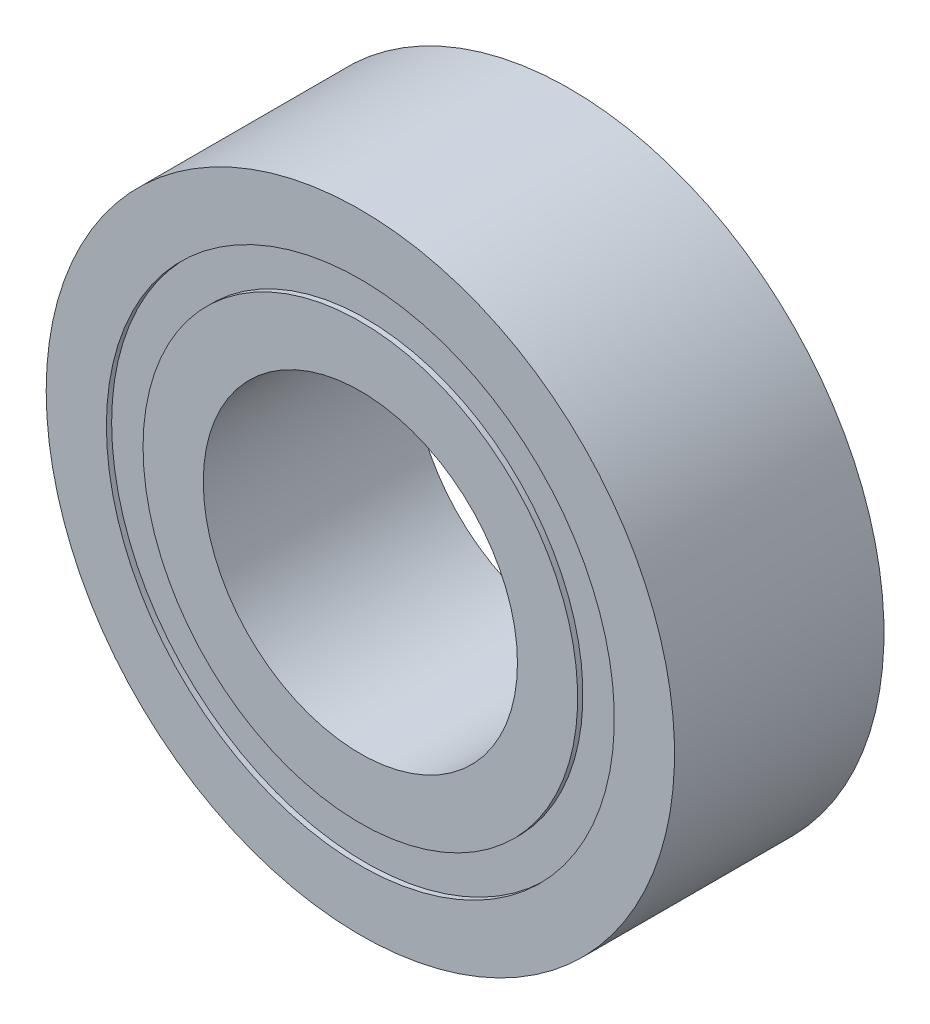
ISO-10303-21;
HEADER;
FILE_DESCRIPTION(('STEP AP214'),'2;1');
FILE_NAME('part.step','',(''),(''),'','','');
FILE_SCHEMA(('AUTOMOTIVE_DESIGN { 1 0 10303 214 1 1 1 1 }'));
ENDSEC;
DATA;
#1=APPLICATION_CONTEXT('core data for automotive mechanical design processes');
#2=APPLICATION_PROTOCOL_DEFINITION('international standard','automotive_design',2000,#1);
#3=PRODUCT_CONTEXT('',#1,'mechanical');
#4=PRODUCT('Part','Part','',(#3));
#5=PRODUCT_RELATED_PRODUCT_CATEGORY('part','',(#4));
#6=PRODUCT_DEFINITION_FORMATION('','',#4);
#7=PRODUCT_DEFINITION_CONTEXT('part definition',#1,'design');
#8=PRODUCT_DEFINITION('design','',#6,#7);
#9=PRODUCT_DEFINITION_SHAPE('','',#8);
#10=(LENGTH_UNIT() NAMED_UNIT(*) SI_UNIT(.MILLI.,.METRE.));
#11=(NAMED_UNIT(*) PLANE_ANGLE_UNIT() SI_UNIT($,.RADIAN.));
#12=(NAMED_UNIT(*) SI_UNIT($,.STERADIAN.) SOLID_ANGLE_UNIT());
#13=UNCERTAINTY_MEASURE_WITH_UNIT(LENGTH_MEASURE(1.E-05),#10,'distance_accuracy_value','');
#14=(GEOMETRIC_REPRESENTATION_CONTEXT(3) GLOBAL_UNCERTAINTY_ASSIGNED_CONTEXT((#13)) GLOBAL_UNIT_ASSIGNED_CONTEXT((#10,
#11,#12)) REPRESENTATION_CONTEXT('',''));
#15=CARTESIAN_POINT('',(0.,0.,0.));
#16=DIRECTION('',(0.,0.,1.));
#17=DIRECTION('',(1.,0.,0.));
#18=AXIS2_PLACEMENT_3D('',#15,#16,#17);
#19=CARTESIAN_POINT('',(0.,0.,0.));
#20=DIRECTION('',(0.,0.,-1.));
#21=DIRECTION('',(-1.,0.,0.));
#22=AXIS2_PLACEMENT_3D('',#19,#20,#21);
#23=CYLINDRICAL_SURFACE('',#22,3.);
#24=CARTESIAN_POINT('',(0.,0.,4.));
#25=DIRECTION('',(0.,0.,-1.));
#26=DIRECTION('',(-1.,0.,0.));
#27=AXIS2_PLACEMENT_3D('',#24,#25,#26);
#28=CIRCLE('',#27,3.);
#29=CARTESIAN_POINT('',(-3.,0.,4.));
#30=VERTEX_POINT('',#29);
#31=EDGE_CURVE('E67',#30,#30,#28,.T.);
#32=ORIENTED_EDGE('',*,*,#31,.F.);
#33=EDGE_LOOP('',(#32));
#34=FACE_BOUND('',#33,.T.);
#35=CARTESIAN_POINT('',(0.,0.,0.));
#36=DIRECTION('',(0.,0.,-1.));
#37=DIRECTION('',(-1.,0.,0.));
#38=AXIS2_PLACEMENT_3D('',#35,#36,#37);
#39=CIRCLE('',#38,3.);
#40=CARTESIAN_POINT('',(-3.,0.,0.));
#41=VERTEX_POINT('',#40);
#42=EDGE_CURVE('E10',#41,#41,#39,.T.);
#43=ORIENTED_EDGE('',*,*,#42,.T.);
#44=EDGE_LOOP('',(#43));
#45=FACE_BOUND('',#44,.T.);
#46=ADVANCED_FACE('F15',(#34,#45),#23,.F.);
#47=CARTESIAN_POINT('',(3.575,0.,0.));
#48=DIRECTION('',(0.,0.,1.));
#49=DIRECTION('',(1.,0.,0.));
#50=AXIS2_PLACEMENT_3D('',#47,#48,#49);
#51=PLANE('',#50);
#52=ORIENTED_EDGE('',*,*,#42,.F.);
#53=EDGE_LOOP('',(#52));
#54=FACE_BOUND('',#53,.T.);
#55=CARTESIAN_POINT('',(0.,0.,0.));
#56=DIRECTION('',(0.,0.,-1.));
#57=DIRECTION('',(-1.,0.,0.));
#58=AXIS2_PLACEMENT_3D('',#55,#56,#57);
#59=CIRCLE('',#58,4.15);
#60=CARTESIAN_POINT('',(-4.15,0.,0.));
#61=VERTEX_POINT('',#60);
#62=EDGE_CURVE('E22',#61,#61,#59,.T.);
#63=ORIENTED_EDGE('',*,*,#62,.T.);
#64=EDGE_LOOP('',(#63));
#65=FACE_BOUND('',#64,.T.);
#66=ADVANCED_FACE('F75',(#54,#65),#51,.F.);
#67=CARTESIAN_POINT('',(0.,0.,0.));
#68=DIRECTION('',(0.,0.,-1.));
#69=DIRECTION('',(-1.,0.,0.));
#70=AXIS2_PLACEMENT_3D('',#67,#68,#69);
#71=CYLINDRICAL_SURFACE('',#70,4.15);
#72=ORIENTED_EDGE('',*,*,#62,.F.);
#73=EDGE_LOOP('',(#72));
#74=FACE_BOUND('',#73,.T.);
#75=CARTESIAN_POINT('',(0.,0.,0.1));
#76=DIRECTION('',(0.,0.,-1.));
#77=DIRECTION('',(-1.,0.,0.));
#78=AXIS2_PLACEMENT_3D('',#75,#76,#77);
#79=CIRCLE('',#78,4.15);
#80=CARTESIAN_POINT('',(-4.15,0.,0.1));
#81=VERTEX_POINT('',#80);
#82=EDGE_CURVE('E30',#81,#81,#79,.T.);
#83=ORIENTED_EDGE('',*,*,#82,.T.);
#84=EDGE_LOOP('',(#83));
#85=FACE_BOUND('',#84,.T.);
#86=ADVANCED_FACE('F79',(#74,#85),#71,.T.);
#87=CARTESIAN_POINT('',(4.5,0.,0.1));
#88=DIRECTION('',(0.,0.,1.));
#89=DIRECTION('',(1.,0.,0.));
#90=AXIS2_PLACEMENT_3D('',#87,#88,#89);
#91=PLANE('',#90);
#92=ORIENTED_EDGE('',*,*,#82,.F.);
#93=EDGE_LOOP('',(#92));
#94=FACE_BOUND('',#93,.T.);
#95=CARTESIAN_POINT('',(0.,0.,0.1));
#96=DIRECTION('',(0.,0.,-1.));
#97=DIRECTION('',(-1.,0.,0.));
#98=AXIS2_PLACEMENT_3D('',#95,#96,#97);
#99=CIRCLE('',#98,4.85);
#100=CARTESIAN_POINT('',(-4.85,0.,0.1));
#101=VERTEX_POINT('',#100);
#102=EDGE_CURVE('E37',#101,#101,#99,.T.);
#103=ORIENTED_EDGE('',*,*,#102,.T.);
#104=EDGE_LOOP('',(#103));
#105=FACE_BOUND('',#104,.T.);
#106=ADVANCED_FACE('F83',(#94,#105),#91,.F.);
#107=CARTESIAN_POINT('',(0.,0.,0.));
#108=DIRECTION('',(0.,0.,-1.));
#109=DIRECTION('',(-1.,0.,0.));
#110=AXIS2_PLACEMENT_3D('',#107,#108,#109);
#111=CYLINDRICAL_SURFACE('',#110,4.85);
#112=ORIENTED_EDGE('',*,*,#102,.F.);
#113=EDGE_LOOP('',(#112));
#114=FACE_BOUND('',#113,.T.);
#115=CARTESIAN_POINT('',(0.,0.,0.));
#116=DIRECTION('',(0.,0.,-1.));
#117=DIRECTION('',(-1.,0.,0.));
#118=AXIS2_PLACEMENT_3D('',#115,#116,#117);
#119=CIRCLE('',#118,4.85);
#120=CARTESIAN_POINT('',(-4.85,0.,0.));
#121=VERTEX_POINT('',#120);
#122=EDGE_CURVE('E43',#121,#121,#119,.T.);
#123=ORIENTED_EDGE('',*,*,#122,.T.);
#124=EDGE_LOOP('',(#123));
#125=FACE_BOUND('',#124,.T.);
#126=ADVANCED_FACE('F89',(#114,#125),#111,.F.);
#127=CARTESIAN_POINT('',(5.425,0.,0.));
#128=DIRECTION('',(0.,0.,1.));
#129=DIRECTION('',(1.,0.,0.));
#130=AXIS2_PLACEMENT_3D('',#127,#128,#129);
#131=PLANE('',#130);
#132=ORIENTED_EDGE('',*,*,#122,.F.);
#133=EDGE_LOOP('',(#132));
#134=FACE_BOUND('',#133,.T.);
#135=CARTESIAN_POINT('',(0.,0.,0.));
#136=DIRECTION('',(0.,0.,-1.));
#137=DIRECTION('',(-1.,0.,0.));
#138=AXIS2_PLACEMENT_3D('',#135,#136,#137);
#139=CIRCLE('',#138,6.);
#140=CARTESIAN_POINT('',(-6.,0.,0.));
#141=VERTEX_POINT('',#140);
#142=EDGE_CURVE('E47',#141,#141,#139,.T.);
#143=ORIENTED_EDGE('',*,*,#142,.T.);
#144=EDGE_LOOP('',(#143));
#145=FACE_BOUND('',#144,.T.);
#146=ADVANCED_FACE('F93',(#134,#145),#131,.F.);
#147=CARTESIAN_POINT('',(0.,0.,0.));
#148=DIRECTION('',(0.,0.,-1.));
#149=DIRECTION('',(-1.,0.,0.));
#150=AXIS2_PLACEMENT_3D('',#147,#148,#149);
#151=CYLINDRICAL_SURFACE('',#150,6.);
#152=ORIENTED_EDGE('',*,*,#142,.F.);
#153=EDGE_LOOP('',(#152));
#154=FACE_BOUND('',#153,.T.);
#155=CARTESIAN_POINT('',(0.,0.,4.));
#156=DIRECTION('',(0.,0.,-1.));
#157=DIRECTION('',(-1.,0.,0.));
#158=AXIS2_PLACEMENT_3D('',#155,#156,#157);
#159=CIRCLE('',#158,6.);
#160=CARTESIAN_POINT('',(-6.,0.,4.));
#161=VERTEX_POINT('',#160);
#162=EDGE_CURVE('E51',#161,#161,#159,.T.);
#163=ORIENTED_EDGE('',*,*,#162,.T.);
#164=EDGE_LOOP('',(#163));
#165=FACE_BOUND('',#164,.T.);
#166=ADVANCED_FACE('F97',(#154,#165),#151,.T.);
#167=CARTESIAN_POINT('',(5.425,0.,4.));
#168=DIRECTION('',(0.,0.,-1.));
#169=DIRECTION('',(-1.,0.,0.));
#170=AXIS2_PLACEMENT_3D('',#167,#168,#169);
#171=PLANE('',#170);
#172=ORIENTED_EDGE('',*,*,#162,.F.);
#173=EDGE_LOOP('',(#172));
#174=FACE_BOUND('',#173,.T.);
#175=CARTESIAN_POINT('',(0.,0.,4.));
#176=DIRECTION('',(0.,0.,-1.));
#177=DIRECTION('',(-1.,0.,0.));
#178=AXIS2_PLACEMENT_3D('',#175,#176,#177);
#179=CIRCLE('',#178,4.85);
#180=CARTESIAN_POINT('',(-4.85,0.,4.));
#181=VERTEX_POINT('',#180);
#182=EDGE_CURVE('E55',#181,#181,#179,.T.);
#183=ORIENTED_EDGE('',*,*,#182,.T.);
#184=EDGE_LOOP('',(#183));
#185=FACE_BOUND('',#184,.T.);
#186=ADVANCED_FACE('F101',(#174,#185),#171,.F.);
#187=CARTESIAN_POINT('',(0.,0.,0.));
#188=DIRECTION('',(0.,0.,-1.));
#189=DIRECTION('',(-1.,0.,0.));
#190=AXIS2_PLACEMENT_3D('',#187,#188,#189);
#191=CYLINDRICAL_SURFACE('',#190,4.85);
#192=ORIENTED_EDGE('',*,*,#182,.F.);
#193=EDGE_LOOP('',(#192));
#194=FACE_BOUND('',#193,.T.);
#195=CARTESIAN_POINT('',(0.,0.,3.9));
#196=DIRECTION('',(0.,0.,-1.));
#197=DIRECTION('',(-1.,0.,0.));
#198=AXIS2_PLACEMENT_3D('',#195,#196,#197);
#199=CIRCLE('',#198,4.85);
#200=CARTESIAN_POINT('',(-4.85,0.,3.9));
#201=VERTEX_POINT('',#200);
#202=EDGE_CURVE('E58',#201,#201,#199,.T.);
#203=ORIENTED_EDGE('',*,*,#202,.T.);
#204=EDGE_LOOP('',(#203));
#205=FACE_BOUND('',#204,.T.);
#206=ADVANCED_FACE('F105',(#194,#205),#191,.F.);
#207=CARTESIAN_POINT('',(4.5,0.,3.9));
#208=DIRECTION('',(0.,0.,-1.));
#209=DIRECTION('',(-1.,0.,0.));
#210=AXIS2_PLACEMENT_3D('',#207,#208,#209);
#211=PLANE('',#210);
#212=ORIENTED_EDGE('',*,*,#202,.F.);
#213=EDGE_LOOP('',(#212));
#214=FACE_BOUND('',#213,.T.);
#215=CARTESIAN_POINT('',(0.,0.,3.9));
#216=DIRECTION('',(0.,0.,-1.));
#217=DIRECTION('',(-1.,0.,0.));
#218=AXIS2_PLACEMENT_3D('',#215,#216,#217);
#219=CIRCLE('',#218,4.15);
#220=CARTESIAN_POINT('',(-4.15,0.,3.9));
#221=VERTEX_POINT('',#220);
#222=EDGE_CURVE('E61',#221,#221,#219,.T.);
#223=ORIENTED_EDGE('',*,*,#222,.T.);
#224=EDGE_LOOP('',(#223));
#225=FACE_BOUND('',#224,.T.);
#226=ADVANCED_FACE('F109',(#214,#225),#211,.F.);
#227=CARTESIAN_POINT('',(0.,0.,0.));
#228=DIRECTION('',(0.,0.,-1.));
#229=DIRECTION('',(-1.,0.,0.));
#230=AXIS2_PLACEMENT_3D('',#227,#228,#229);
#231=CYLINDRICAL_SURFACE('',#230,4.15);
#232=ORIENTED_EDGE('',*,*,#222,.F.);
#233=EDGE_LOOP('',(#232));
#234=FACE_BOUND('',#233,.T.);
#235=CARTESIAN_POINT('',(0.,0.,4.));
#236=DIRECTION('',(0.,0.,-1.));
#237=DIRECTION('',(-1.,0.,0.));
#238=AXIS2_PLACEMENT_3D('',#235,#236,#237);
#239=CIRCLE('',#238,4.15);
#240=CARTESIAN_POINT('',(-4.15,0.,4.));
#241=VERTEX_POINT('',#240);
#242=EDGE_CURVE('E64',#241,#241,#239,.T.);
#243=ORIENTED_EDGE('',*,*,#242,.T.);
#244=EDGE_LOOP('',(#243));
#245=FACE_BOUND('',#244,.T.);
#246=ADVANCED_FACE('F113',(#234,#245),#231,.T.);
#247=CARTESIAN_POINT('',(3.575,0.,4.));
#248=DIRECTION('',(0.,0.,-1.));
#249=DIRECTION('',(-1.,0.,0.));
#250=AXIS2_PLACEMENT_3D('',#247,#248,#249);
#251=PLANE('',#250);
#252=ORIENTED_EDGE('',*,*,#242,.F.);
#253=EDGE_LOOP('',(#252));
#254=FACE_BOUND('',#253,.T.);
#255=ORIENTED_EDGE('',*,*,#31,.T.);
#256=EDGE_LOOP('',(#255));
#257=FACE_BOUND('',#256,.T.);
#258=ADVANCED_FACE('F72',(#254,#257),#251,.F.);
#259=CLOSED_SHELL('',(#46,#66,#86,#106,#126,#146,#166,#186,#206,#226,#246,#258));
#260=MANIFOLD_SOLID_BREP('B1',#259);
#261=ADVANCED_BREP_SHAPE_REPRESENTATION('',(#18,#260),#14);
#262=SHAPE_DEFINITION_REPRESENTATION(#9,#261);
ENDSEC;
END-ISO-10303-21;
